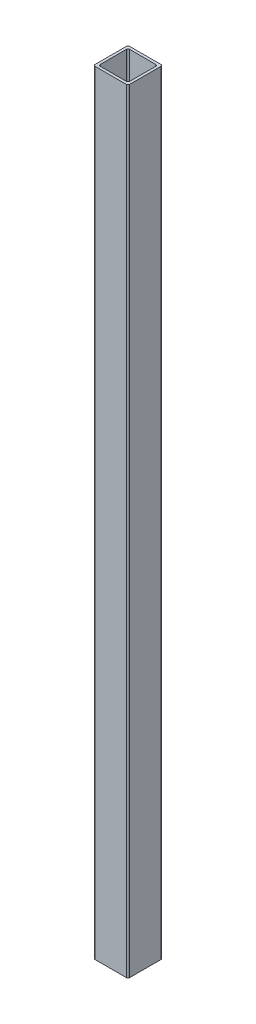
ISO-10303-21;
HEADER;
FILE_DESCRIPTION(('STEP AP214'),'2;1');
FILE_NAME('part.step','',(''),(''),'','','');
FILE_SCHEMA(('AUTOMOTIVE_DESIGN { 1 0 10303 214 1 1 1 1 }'));
ENDSEC;
DATA;
#1=APPLICATION_CONTEXT('core data for automotive mechanical design processes');
#2=APPLICATION_PROTOCOL_DEFINITION('international standard','automotive_design',2000,#1);
#3=PRODUCT_CONTEXT('',#1,'mechanical');
#4=PRODUCT('Part','Part','',(#3));
#5=PRODUCT_RELATED_PRODUCT_CATEGORY('part','',(#4));
#6=PRODUCT_DEFINITION_FORMATION('','',#4);
#7=PRODUCT_DEFINITION_CONTEXT('part definition',#1,'design');
#8=PRODUCT_DEFINITION('design','',#6,#7);
#9=PRODUCT_DEFINITION_SHAPE('','',#8);
#10=(LENGTH_UNIT() NAMED_UNIT(*) SI_UNIT(.MILLI.,.METRE.));
#11=(NAMED_UNIT(*) PLANE_ANGLE_UNIT() SI_UNIT($,.RADIAN.));
#12=(NAMED_UNIT(*) SI_UNIT($,.STERADIAN.) SOLID_ANGLE_UNIT());
#13=UNCERTAINTY_MEASURE_WITH_UNIT(LENGTH_MEASURE(1.E-05),#10,'distance_accuracy_value','');
#14=(GEOMETRIC_REPRESENTATION_CONTEXT(3) GLOBAL_UNCERTAINTY_ASSIGNED_CONTEXT((#13)) GLOBAL_UNIT_ASSIGNED_CONTEXT((#10,
#11,#12)) REPRESENTATION_CONTEXT('',''));
#15=CARTESIAN_POINT('',(0.,0.,0.));
#16=DIRECTION('',(0.,0.,1.));
#17=DIRECTION('',(1.,0.,0.));
#18=AXIS2_PLACEMENT_3D('',#15,#16,#17);
#19=CARTESIAN_POINT('',(-9.,447.59,9.00000000000001));
#20=DIRECTION('',(0.,-1.,0.));
#21=DIRECTION('',(0.,0.,-1.));
#22=AXIS2_PLACEMENT_3D('',#19,#20,#21);
#23=PLANE('',#22);
#24=CARTESIAN_POINT('',(-9.,447.59,9.00000000000001));
#25=DIRECTION('',(0.,1.,0.));
#26=DIRECTION('',(0.,0.,-1.));
#27=AXIS2_PLACEMENT_3D('',#24,#25,#26);
#28=CIRCLE('',#27,1.);
#29=CARTESIAN_POINT('',(-10.,447.59,9.00000000000001));
#30=VERTEX_POINT('',#29);
#31=CARTESIAN_POINT('',(-9.,447.59,10.));
#32=VERTEX_POINT('',#31);
#33=EDGE_CURVE('E215',#30,#32,#28,.T.);
#34=ORIENTED_EDGE('',*,*,#33,.T.);
#35=DIRECTION('',(1.,0.,0.));
#36=VECTOR('',#35,1.);
#37=CARTESIAN_POINT('',(-9.,447.59,10.));
#38=LINE('',#37,#36);
#39=CARTESIAN_POINT('',(9.,447.59,10.));
#40=VERTEX_POINT('',#39);
#41=EDGE_CURVE('E218',#32,#40,#38,.T.);
#42=ORIENTED_EDGE('',*,*,#41,.T.);
#43=CARTESIAN_POINT('',(9.,447.59,9.00000000000001));
#44=DIRECTION('',(0.,1.,0.));
#45=DIRECTION('',(0.,0.,1.));
#46=AXIS2_PLACEMENT_3D('',#43,#44,#45);
#47=CIRCLE('',#46,1.);
#48=CARTESIAN_POINT('',(10.,447.59,9.00000000000001));
#49=VERTEX_POINT('',#48);
#50=EDGE_CURVE('E221',#40,#49,#47,.T.);
#51=ORIENTED_EDGE('',*,*,#50,.T.);
#52=DIRECTION('',(0.,0.,-1.));
#53=VECTOR('',#52,1.);
#54=CARTESIAN_POINT('',(10.,447.59,9.00000000000001));
#55=LINE('',#54,#53);
#56=CARTESIAN_POINT('',(10.,447.59,-9.));
#57=VERTEX_POINT('',#56);
#58=EDGE_CURVE('E223',#49,#57,#55,.T.);
#59=ORIENTED_EDGE('',*,*,#58,.T.);
#60=CARTESIAN_POINT('',(9.,447.59,-9.));
#61=DIRECTION('',(0.,1.,0.));
#62=DIRECTION('',(0.,0.,-1.));
#63=AXIS2_PLACEMENT_3D('',#60,#61,#62);
#64=CIRCLE('',#63,1.);
#65=CARTESIAN_POINT('',(9.,447.59,-10.));
#66=VERTEX_POINT('',#65);
#67=EDGE_CURVE('E225',#57,#66,#64,.T.);
#68=ORIENTED_EDGE('',*,*,#67,.T.);
#69=DIRECTION('',(-1.,0.,0.));
#70=VECTOR('',#69,1.);
#71=CARTESIAN_POINT('',(-9.,447.59,-10.));
#72=LINE('',#71,#70);
#73=CARTESIAN_POINT('',(-9.,447.59,-10.));
#74=VERTEX_POINT('',#73);
#75=EDGE_CURVE('E227',#66,#74,#72,.T.);
#76=ORIENTED_EDGE('',*,*,#75,.T.);
#77=CARTESIAN_POINT('',(-9.,447.59,-9.));
#78=DIRECTION('',(0.,1.,0.));
#79=DIRECTION('',(0.,0.,-1.));
#80=AXIS2_PLACEMENT_3D('',#77,#78,#79);
#81=CIRCLE('',#80,1.);
#82=CARTESIAN_POINT('',(-10.,447.59,-9.));
#83=VERTEX_POINT('',#82);
#84=EDGE_CURVE('E229',#74,#83,#81,.T.);
#85=ORIENTED_EDGE('',*,*,#84,.T.);
#86=DIRECTION('',(0.,0.,1.));
#87=VECTOR('',#86,1.);
#88=CARTESIAN_POINT('',(-10.,447.59,9.00000000000001));
#89=LINE('',#88,#87);
#90=EDGE_CURVE('E231',#83,#30,#89,.T.);
#91=ORIENTED_EDGE('',*,*,#90,.T.);
#92=EDGE_LOOP('',(#34,#42,#51,#59,#68,#76,#85,#91));
#93=FACE_BOUND('',#92,.T.);
#94=CARTESIAN_POINT('',(-7.5,447.59,7.5));
#95=DIRECTION('',(0.,1.,0.));
#96=DIRECTION('',(0.,0.,-1.));
#97=AXIS2_PLACEMENT_3D('',#94,#95,#96);
#98=CIRCLE('',#97,1.);
#99=CARTESIAN_POINT('',(-8.5,447.59,7.5));
#100=VERTEX_POINT('',#99);
#101=CARTESIAN_POINT('',(-7.5,447.59,8.5));
#102=VERTEX_POINT('',#101);
#103=EDGE_CURVE('E150',#100,#102,#98,.T.);
#104=ORIENTED_EDGE('',*,*,#103,.F.);
#105=DIRECTION('',(0.,0.,1.));
#106=VECTOR('',#105,1.);
#107=CARTESIAN_POINT('',(-8.5,447.59,7.5));
#108=LINE('',#107,#106);
#109=CARTESIAN_POINT('',(-8.5,447.59,-7.5));
#110=VERTEX_POINT('',#109);
#111=EDGE_CURVE('E183',#110,#100,#108,.T.);
#112=ORIENTED_EDGE('',*,*,#111,.F.);
#113=CARTESIAN_POINT('',(-7.5,447.59,-7.5));
#114=DIRECTION('',(0.,1.,0.));
#115=DIRECTION('',(0.,0.,-1.));
#116=AXIS2_PLACEMENT_3D('',#113,#114,#115);
#117=CIRCLE('',#116,0.999999999999999);
#118=CARTESIAN_POINT('',(-7.5,447.59,-8.5));
#119=VERTEX_POINT('',#118);
#120=EDGE_CURVE('E181',#119,#110,#117,.T.);
#121=ORIENTED_EDGE('',*,*,#120,.F.);
#122=DIRECTION('',(-1.,0.,0.));
#123=VECTOR('',#122,1.);
#124=CARTESIAN_POINT('',(-7.5,447.59,-8.5));
#125=LINE('',#124,#123);
#126=CARTESIAN_POINT('',(7.5,447.59,-8.5));
#127=VERTEX_POINT('',#126);
#128=EDGE_CURVE('E179',#127,#119,#125,.T.);
#129=ORIENTED_EDGE('',*,*,#128,.F.);
#130=CARTESIAN_POINT('',(7.5,447.59,-7.5));
#131=DIRECTION('',(0.,1.,0.));
#132=DIRECTION('',(0.,0.,-1.));
#133=AXIS2_PLACEMENT_3D('',#130,#131,#132);
#134=CIRCLE('',#133,1.);
#135=CARTESIAN_POINT('',(8.5,447.59,-7.5));
#136=VERTEX_POINT('',#135);
#137=EDGE_CURVE('E177',#136,#127,#134,.T.);
#138=ORIENTED_EDGE('',*,*,#137,.F.);
#139=DIRECTION('',(0.,0.,-1.));
#140=VECTOR('',#139,1.);
#141=CARTESIAN_POINT('',(8.5,447.59,7.5));
#142=LINE('',#141,#140);
#143=CARTESIAN_POINT('',(8.5,447.59,7.5));
#144=VERTEX_POINT('',#143);
#145=EDGE_CURVE('E173',#144,#136,#142,.T.);
#146=ORIENTED_EDGE('',*,*,#145,.F.);
#147=CARTESIAN_POINT('',(7.5,447.59,7.5));
#148=DIRECTION('',(0.,1.,0.));
#149=DIRECTION('',(0.,0.,1.));
#150=AXIS2_PLACEMENT_3D('',#147,#148,#149);
#151=CIRCLE('',#150,1.);
#152=CARTESIAN_POINT('',(7.5,447.59,8.5));
#153=VERTEX_POINT('',#152);
#154=EDGE_CURVE('E171',#153,#144,#151,.T.);
#155=ORIENTED_EDGE('',*,*,#154,.F.);
#156=DIRECTION('',(1.,0.,0.));
#157=VECTOR('',#156,1.);
#158=CARTESIAN_POINT('',(-7.5,447.59,8.5));
#159=LINE('',#158,#157);
#160=EDGE_CURVE('E158',#102,#153,#159,.T.);
#161=ORIENTED_EDGE('',*,*,#160,.F.);
#162=EDGE_LOOP('',(#104,#112,#121,#129,#138,#146,#155,#161));
#163=FACE_BOUND('',#162,.T.);
#164=ADVANCED_FACE('F37',(#93,#163),#23,.F.);
#165=CARTESIAN_POINT('',(-9.,0.,9.00000000000001));
#166=DIRECTION('',(0.,-1.,0.));
#167=DIRECTION('',(0.,0.,-1.));
#168=AXIS2_PLACEMENT_3D('',#165,#166,#167);
#169=PLANE('',#168);
#170=CARTESIAN_POINT('',(-9.,0.,9.00000000000001));
#171=DIRECTION('',(0.,1.,0.));
#172=DIRECTION('',(0.,0.,-1.));
#173=AXIS2_PLACEMENT_3D('',#170,#171,#172);
#174=CIRCLE('',#173,1.);
#175=CARTESIAN_POINT('',(-10.,0.,9.00000000000001));
#176=VERTEX_POINT('',#175);
#177=CARTESIAN_POINT('',(-9.,0.,10.));
#178=VERTEX_POINT('',#177);
#179=EDGE_CURVE('E166',#176,#178,#174,.T.);
#180=ORIENTED_EDGE('',*,*,#179,.F.);
#181=DIRECTION('',(0.,0.,1.));
#182=VECTOR('',#181,1.);
#183=CARTESIAN_POINT('',(-10.,0.,9.00000000000001));
#184=LINE('',#183,#182);
#185=CARTESIAN_POINT('',(-10.,0.,-9.));
#186=VERTEX_POINT('',#185);
#187=EDGE_CURVE('E219',#186,#176,#184,.T.);
#188=ORIENTED_EDGE('',*,*,#187,.F.);
#189=CARTESIAN_POINT('',(-9.,0.,-9.));
#190=DIRECTION('',(0.,1.,0.));
#191=DIRECTION('',(0.,0.,-1.));
#192=AXIS2_PLACEMENT_3D('',#189,#190,#191);
#193=CIRCLE('',#192,1.);
#194=CARTESIAN_POINT('',(-9.,0.,-10.));
#195=VERTEX_POINT('',#194);
#196=EDGE_CURVE('E246',#195,#186,#193,.T.);
#197=ORIENTED_EDGE('',*,*,#196,.F.);
#198=DIRECTION('',(-1.,0.,0.));
#199=VECTOR('',#198,1.);
#200=CARTESIAN_POINT('',(-9.,0.,-10.));
#201=LINE('',#200,#199);
#202=CARTESIAN_POINT('',(9.,0.,-10.));
#203=VERTEX_POINT('',#202);
#204=EDGE_CURVE('E244',#203,#195,#201,.T.);
#205=ORIENTED_EDGE('',*,*,#204,.F.);
#206=CARTESIAN_POINT('',(9.,0.,-9.));
#207=DIRECTION('',(0.,1.,0.));
#208=DIRECTION('',(0.,0.,-1.));
#209=AXIS2_PLACEMENT_3D('',#206,#207,#208);
#210=CIRCLE('',#209,1.);
#211=CARTESIAN_POINT('',(10.,0.,-9.));
#212=VERTEX_POINT('',#211);
#213=EDGE_CURVE('E242',#212,#203,#210,.T.);
#214=ORIENTED_EDGE('',*,*,#213,.F.);
#215=DIRECTION('',(0.,0.,-1.));
#216=VECTOR('',#215,1.);
#217=CARTESIAN_POINT('',(10.,0.,9.00000000000001));
#218=LINE('',#217,#216);
#219=CARTESIAN_POINT('',(10.,0.,9.00000000000001));
#220=VERTEX_POINT('',#219);
#221=EDGE_CURVE('E240',#220,#212,#218,.T.);
#222=ORIENTED_EDGE('',*,*,#221,.F.);
#223=CARTESIAN_POINT('',(9.,0.,9.00000000000001));
#224=DIRECTION('',(0.,1.,0.));
#225=DIRECTION('',(0.,0.,1.));
#226=AXIS2_PLACEMENT_3D('',#223,#224,#225);
#227=CIRCLE('',#226,1.);
#228=CARTESIAN_POINT('',(9.,0.,10.));
#229=VERTEX_POINT('',#228);
#230=EDGE_CURVE('E238',#229,#220,#227,.T.);
#231=ORIENTED_EDGE('',*,*,#230,.F.);
#232=DIRECTION('',(1.,0.,0.));
#233=VECTOR('',#232,1.);
#234=CARTESIAN_POINT('',(-9.,0.,10.));
#235=LINE('',#234,#233);
#236=EDGE_CURVE('E236',#178,#229,#235,.T.);
#237=ORIENTED_EDGE('',*,*,#236,.F.);
#238=EDGE_LOOP('',(#180,#188,#197,#205,#214,#222,#231,#237));
#239=FACE_BOUND('',#238,.T.);
#240=DIRECTION('',(0.,0.,1.));
#241=VECTOR('',#240,1.);
#242=CARTESIAN_POINT('',(-8.5,0.,7.5));
#243=LINE('',#242,#241);
#244=CARTESIAN_POINT('',(-8.5,0.,-7.5));
#245=VERTEX_POINT('',#244);
#246=CARTESIAN_POINT('',(-8.5,0.,7.5));
#247=VERTEX_POINT('',#246);
#248=EDGE_CURVE('E159',#245,#247,#243,.T.);
#249=ORIENTED_EDGE('',*,*,#248,.T.);
#250=CARTESIAN_POINT('',(-7.5,0.,7.5));
#251=DIRECTION('',(0.,1.,0.));
#252=DIRECTION('',(0.,0.,-1.));
#253=AXIS2_PLACEMENT_3D('',#250,#251,#252);
#254=CIRCLE('',#253,1.);
#255=CARTESIAN_POINT('',(-7.5,0.,8.5));
#256=VERTEX_POINT('',#255);
#257=EDGE_CURVE('E60',#247,#256,#254,.T.);
#258=ORIENTED_EDGE('',*,*,#257,.T.);
#259=DIRECTION('',(1.,0.,0.));
#260=VECTOR('',#259,1.);
#261=CARTESIAN_POINT('',(-7.5,0.,8.5));
#262=LINE('',#261,#260);
#263=CARTESIAN_POINT('',(7.5,0.,8.5));
#264=VERTEX_POINT('',#263);
#265=EDGE_CURVE('E165',#256,#264,#262,.T.);
#266=ORIENTED_EDGE('',*,*,#265,.T.);
#267=CARTESIAN_POINT('',(7.5,0.,7.5));
#268=DIRECTION('',(0.,1.,0.));
#269=DIRECTION('',(0.,0.,1.));
#270=AXIS2_PLACEMENT_3D('',#267,#268,#269);
#271=CIRCLE('',#270,1.);
#272=CARTESIAN_POINT('',(8.5,0.,7.5));
#273=VERTEX_POINT('',#272);
#274=EDGE_CURVE('E187',#264,#273,#271,.T.);
#275=ORIENTED_EDGE('',*,*,#274,.T.);
#276=DIRECTION('',(0.,0.,-1.));
#277=VECTOR('',#276,1.);
#278=CARTESIAN_POINT('',(8.5,0.,7.5));
#279=LINE('',#278,#277);
#280=CARTESIAN_POINT('',(8.5,0.,-7.5));
#281=VERTEX_POINT('',#280);
#282=EDGE_CURVE('E190',#273,#281,#279,.T.);
#283=ORIENTED_EDGE('',*,*,#282,.T.);
#284=CARTESIAN_POINT('',(7.5,0.,-7.5));
#285=DIRECTION('',(0.,1.,0.));
#286=DIRECTION('',(0.,0.,-1.));
#287=AXIS2_PLACEMENT_3D('',#284,#285,#286);
#288=CIRCLE('',#287,1.);
#289=CARTESIAN_POINT('',(7.5,0.,-8.5));
#290=VERTEX_POINT('',#289);
#291=EDGE_CURVE('E193',#281,#290,#288,.T.);
#292=ORIENTED_EDGE('',*,*,#291,.T.);
#293=DIRECTION('',(-1.,0.,0.));
#294=VECTOR('',#293,1.);
#295=CARTESIAN_POINT('',(-7.5,0.,-8.5));
#296=LINE('',#295,#294);
#297=CARTESIAN_POINT('',(-7.5,0.,-8.5));
#298=VERTEX_POINT('',#297);
#299=EDGE_CURVE('E196',#290,#298,#296,.T.);
#300=ORIENTED_EDGE('',*,*,#299,.T.);
#301=CARTESIAN_POINT('',(-7.5,0.,-7.5));
#302=DIRECTION('',(0.,1.,0.));
#303=DIRECTION('',(0.,0.,-1.));
#304=AXIS2_PLACEMENT_3D('',#301,#302,#303);
#305=CIRCLE('',#304,0.999999999999999);
#306=EDGE_CURVE('E199',#298,#245,#305,.T.);
#307=ORIENTED_EDGE('',*,*,#306,.T.);
#308=EDGE_LOOP('',(#249,#258,#266,#275,#283,#292,#300,#307));
#309=FACE_BOUND('',#308,.T.);
#310=ADVANCED_FACE('F276',(#239,#309),#169,.T.);
#311=CARTESIAN_POINT('',(-9.,447.59,9.00000000000001));
#312=DIRECTION('',(0.,-1.,0.));
#313=DIRECTION('',(0.,0.,-1.));
#314=AXIS2_PLACEMENT_3D('',#311,#312,#313);
#315=CYLINDRICAL_SURFACE('',#314,1.);
#316=ORIENTED_EDGE('',*,*,#179,.T.);
#317=DIRECTION('',(0.,-1.,0.));
#318=VECTOR('',#317,1.);
#319=CARTESIAN_POINT('',(-9.,447.59,10.));
#320=LINE('',#319,#318);
#321=EDGE_CURVE('E11',#32,#178,#320,.T.);
#322=ORIENTED_EDGE('',*,*,#321,.F.);
#323=ORIENTED_EDGE('',*,*,#33,.F.);
#324=DIRECTION('',(0.,-1.,0.));
#325=VECTOR('',#324,1.);
#326=CARTESIAN_POINT('',(-10.,447.59,9.00000000000001));
#327=LINE('',#326,#325);
#328=EDGE_CURVE('E233',#30,#176,#327,.T.);
#329=ORIENTED_EDGE('',*,*,#328,.T.);
#330=EDGE_LOOP('',(#316,#322,#323,#329));
#331=FACE_BOUND('',#330,.T.);
#332=ADVANCED_FACE('F39',(#331),#315,.T.);
#333=CARTESIAN_POINT('',(-9.,447.59,10.));
#334=DIRECTION('',(0.,0.,-1.));
#335=DIRECTION('',(-1.,0.,0.));
#336=AXIS2_PLACEMENT_3D('',#333,#334,#335);
#337=PLANE('',#336);
#338=ORIENTED_EDGE('',*,*,#236,.T.);
#339=DIRECTION('',(0.,-1.,0.));
#340=VECTOR('',#339,1.);
#341=CARTESIAN_POINT('',(9.,447.59,10.));
#342=LINE('',#341,#340);
#343=EDGE_CURVE('E45',#40,#229,#342,.T.);
#344=ORIENTED_EDGE('',*,*,#343,.F.);
#345=ORIENTED_EDGE('',*,*,#41,.F.);
#346=ORIENTED_EDGE('',*,*,#321,.T.);
#347=EDGE_LOOP('',(#338,#344,#345,#346));
#348=FACE_BOUND('',#347,.T.);
#349=ADVANCED_FACE('F293',(#348),#337,.F.);
#350=CARTESIAN_POINT('',(9.,447.59,9.00000000000001));
#351=DIRECTION('',(0.,-1.,0.));
#352=DIRECTION('',(0.,0.,-1.));
#353=AXIS2_PLACEMENT_3D('',#350,#351,#352);
#354=CYLINDRICAL_SURFACE('',#353,1.);
#355=ORIENTED_EDGE('',*,*,#230,.T.);
#356=DIRECTION('',(0.,-1.,0.));
#357=VECTOR('',#356,1.);
#358=CARTESIAN_POINT('',(10.,447.59,9.00000000000001));
#359=LINE('',#358,#357);
#360=EDGE_CURVE('E263',#49,#220,#359,.T.);
#361=ORIENTED_EDGE('',*,*,#360,.F.);
#362=ORIENTED_EDGE('',*,*,#50,.F.);
#363=ORIENTED_EDGE('',*,*,#343,.T.);
#364=EDGE_LOOP('',(#355,#361,#362,#363));
#365=FACE_BOUND('',#364,.T.);
#366=ADVANCED_FACE('F270',(#365),#354,.T.);
#367=CARTESIAN_POINT('',(10.,447.59,9.00000000000001));
#368=DIRECTION('',(-1.,0.,0.));
#369=DIRECTION('',(0.,0.,1.));
#370=AXIS2_PLACEMENT_3D('',#367,#368,#369);
#371=PLANE('',#370);
#372=ORIENTED_EDGE('',*,*,#221,.T.);
#373=DIRECTION('',(0.,-1.,0.));
#374=VECTOR('',#373,1.);
#375=CARTESIAN_POINT('',(10.,447.59,-9.));
#376=LINE('',#375,#374);
#377=EDGE_CURVE('E260',#57,#212,#376,.T.);
#378=ORIENTED_EDGE('',*,*,#377,.F.);
#379=ORIENTED_EDGE('',*,*,#58,.F.);
#380=ORIENTED_EDGE('',*,*,#360,.T.);
#381=EDGE_LOOP('',(#372,#378,#379,#380));
#382=FACE_BOUND('',#381,.T.);
#383=ADVANCED_FACE('F282',(#382),#371,.F.);
#384=CARTESIAN_POINT('',(9.,447.59,-9.));
#385=DIRECTION('',(0.,-1.,0.));
#386=DIRECTION('',(0.,0.,-1.));
#387=AXIS2_PLACEMENT_3D('',#384,#385,#386);
#388=CYLINDRICAL_SURFACE('',#387,1.);
#389=ORIENTED_EDGE('',*,*,#213,.T.);
#390=DIRECTION('',(0.,-1.,0.));
#391=VECTOR('',#390,1.);
#392=CARTESIAN_POINT('',(9.,447.59,-10.));
#393=LINE('',#392,#391);
#394=EDGE_CURVE('E257',#66,#203,#393,.T.);
#395=ORIENTED_EDGE('',*,*,#394,.F.);
#396=ORIENTED_EDGE('',*,*,#67,.F.);
#397=ORIENTED_EDGE('',*,*,#377,.T.);
#398=EDGE_LOOP('',(#389,#395,#396,#397));
#399=FACE_BOUND('',#398,.T.);
#400=ADVANCED_FACE('F286',(#399),#388,.T.);
#401=CARTESIAN_POINT('',(-9.,447.59,-10.));
#402=DIRECTION('',(0.,0.,1.));
#403=DIRECTION('',(1.,0.,0.));
#404=AXIS2_PLACEMENT_3D('',#401,#402,#403);
#405=PLANE('',#404);
#406=ORIENTED_EDGE('',*,*,#204,.T.);
#407=DIRECTION('',(0.,-1.,0.));
#408=VECTOR('',#407,1.);
#409=CARTESIAN_POINT('',(-9.,447.59,-10.));
#410=LINE('',#409,#408);
#411=EDGE_CURVE('E254',#74,#195,#410,.T.);
#412=ORIENTED_EDGE('',*,*,#411,.F.);
#413=ORIENTED_EDGE('',*,*,#75,.F.);
#414=ORIENTED_EDGE('',*,*,#394,.T.);
#415=EDGE_LOOP('',(#406,#412,#413,#414));
#416=FACE_BOUND('',#415,.T.);
#417=ADVANCED_FACE('F306',(#416),#405,.F.);
#418=CARTESIAN_POINT('',(-9.,447.59,-9.));
#419=DIRECTION('',(0.,-1.,0.));
#420=DIRECTION('',(0.,0.,-1.));
#421=AXIS2_PLACEMENT_3D('',#418,#419,#420);
#422=CYLINDRICAL_SURFACE('',#421,1.);
#423=ORIENTED_EDGE('',*,*,#196,.T.);
#424=DIRECTION('',(0.,-1.,0.));
#425=VECTOR('',#424,1.);
#426=CARTESIAN_POINT('',(-10.,447.59,-9.));
#427=LINE('',#426,#425);
#428=EDGE_CURVE('E251',#83,#186,#427,.T.);
#429=ORIENTED_EDGE('',*,*,#428,.F.);
#430=ORIENTED_EDGE('',*,*,#84,.F.);
#431=ORIENTED_EDGE('',*,*,#411,.T.);
#432=EDGE_LOOP('',(#423,#429,#430,#431));
#433=FACE_BOUND('',#432,.T.);
#434=ADVANCED_FACE('F304',(#433),#422,.T.);
#435=CARTESIAN_POINT('',(-10.,447.59,9.00000000000001));
#436=DIRECTION('',(1.,0.,0.));
#437=DIRECTION('',(0.,0.,-1.));
#438=AXIS2_PLACEMENT_3D('',#435,#436,#437);
#439=PLANE('',#438);
#440=ORIENTED_EDGE('',*,*,#187,.T.);
#441=ORIENTED_EDGE('',*,*,#328,.F.);
#442=ORIENTED_EDGE('',*,*,#90,.F.);
#443=ORIENTED_EDGE('',*,*,#428,.T.);
#444=EDGE_LOOP('',(#440,#441,#442,#443));
#445=FACE_BOUND('',#444,.T.);
#446=ADVANCED_FACE('F299',(#445),#439,.F.);
#447=CARTESIAN_POINT('',(-7.5,447.59,7.5));
#448=DIRECTION('',(0.,-1.,0.));
#449=DIRECTION('',(0.,0.,-1.));
#450=AXIS2_PLACEMENT_3D('',#447,#448,#449);
#451=CYLINDRICAL_SURFACE('',#450,1.);
#452=ORIENTED_EDGE('',*,*,#257,.F.);
#453=DIRECTION('',(0.,-1.,0.));
#454=VECTOR('',#453,1.);
#455=CARTESIAN_POINT('',(-8.5,447.59,7.5));
#456=LINE('',#455,#454);
#457=EDGE_CURVE('E154',#100,#247,#456,.T.);
#458=ORIENTED_EDGE('',*,*,#457,.F.);
#459=ORIENTED_EDGE('',*,*,#103,.T.);
#460=DIRECTION('',(0.,-1.,0.));
#461=VECTOR('',#460,1.);
#462=CARTESIAN_POINT('',(-7.5,447.59,8.5));
#463=LINE('',#462,#461);
#464=EDGE_CURVE('E153',#102,#256,#463,.T.);
#465=ORIENTED_EDGE('',*,*,#464,.T.);
#466=EDGE_LOOP('',(#452,#458,#459,#465));
#467=FACE_BOUND('',#466,.T.);
#468=ADVANCED_FACE('F152',(#467),#451,.F.);
#469=CARTESIAN_POINT('',(-7.5,447.59,8.5));
#470=DIRECTION('',(0.,0.,-1.));
#471=DIRECTION('',(-1.,0.,0.));
#472=AXIS2_PLACEMENT_3D('',#469,#470,#471);
#473=PLANE('',#472);
#474=ORIENTED_EDGE('',*,*,#265,.F.);
#475=ORIENTED_EDGE('',*,*,#464,.F.);
#476=ORIENTED_EDGE('',*,*,#160,.T.);
#477=DIRECTION('',(0.,-1.,0.));
#478=VECTOR('',#477,1.);
#479=CARTESIAN_POINT('',(7.5,447.59,8.5));
#480=LINE('',#479,#478);
#481=EDGE_CURVE('E167',#153,#264,#480,.T.);
#482=ORIENTED_EDGE('',*,*,#481,.T.);
#483=EDGE_LOOP('',(#474,#475,#476,#482));
#484=FACE_BOUND('',#483,.T.);
#485=ADVANCED_FACE('F162',(#484),#473,.T.);
#486=CARTESIAN_POINT('',(7.5,447.59,7.5));
#487=DIRECTION('',(0.,-1.,0.));
#488=DIRECTION('',(0.,0.,-1.));
#489=AXIS2_PLACEMENT_3D('',#486,#487,#488);
#490=CYLINDRICAL_SURFACE('',#489,1.);
#491=ORIENTED_EDGE('',*,*,#274,.F.);
#492=ORIENTED_EDGE('',*,*,#481,.F.);
#493=ORIENTED_EDGE('',*,*,#154,.T.);
#494=DIRECTION('',(0.,-1.,0.));
#495=VECTOR('',#494,1.);
#496=CARTESIAN_POINT('',(8.5,447.59,7.5));
#497=LINE('',#496,#495);
#498=EDGE_CURVE('E212',#144,#273,#497,.T.);
#499=ORIENTED_EDGE('',*,*,#498,.T.);
#500=EDGE_LOOP('',(#491,#492,#493,#499));
#501=FACE_BOUND('',#500,.T.);
#502=ADVANCED_FACE('F331',(#501),#490,.F.);
#503=CARTESIAN_POINT('',(8.5,447.59,7.5));
#504=DIRECTION('',(-1.,0.,0.));
#505=DIRECTION('',(0.,0.,1.));
#506=AXIS2_PLACEMENT_3D('',#503,#504,#505);
#507=PLANE('',#506);
#508=ORIENTED_EDGE('',*,*,#282,.F.);
#509=ORIENTED_EDGE('',*,*,#498,.F.);
#510=ORIENTED_EDGE('',*,*,#145,.T.);
#511=DIRECTION('',(0.,-1.,0.));
#512=VECTOR('',#511,1.);
#513=CARTESIAN_POINT('',(8.5,447.59,-7.5));
#514=LINE('',#513,#512);
#515=EDGE_CURVE('E210',#136,#281,#514,.T.);
#516=ORIENTED_EDGE('',*,*,#515,.T.);
#517=EDGE_LOOP('',(#508,#509,#510,#516));
#518=FACE_BOUND('',#517,.T.);
#519=ADVANCED_FACE('F335',(#518),#507,.T.);
#520=CARTESIAN_POINT('',(7.5,447.59,-7.5));
#521=DIRECTION('',(0.,-1.,0.));
#522=DIRECTION('',(0.,0.,-1.));
#523=AXIS2_PLACEMENT_3D('',#520,#521,#522);
#524=CYLINDRICAL_SURFACE('',#523,1.);
#525=ORIENTED_EDGE('',*,*,#291,.F.);
#526=ORIENTED_EDGE('',*,*,#515,.F.);
#527=ORIENTED_EDGE('',*,*,#137,.T.);
#528=DIRECTION('',(0.,-1.,0.));
#529=VECTOR('',#528,1.);
#530=CARTESIAN_POINT('',(7.5,447.59,-8.5));
#531=LINE('',#530,#529);
#532=EDGE_CURVE('E208',#127,#290,#531,.T.);
#533=ORIENTED_EDGE('',*,*,#532,.T.);
#534=EDGE_LOOP('',(#525,#526,#527,#533));
#535=FACE_BOUND('',#534,.T.);
#536=ADVANCED_FACE('F341',(#535),#524,.F.);
#537=CARTESIAN_POINT('',(-7.5,447.59,-8.5));
#538=DIRECTION('',(0.,0.,1.));
#539=DIRECTION('',(1.,0.,0.));
#540=AXIS2_PLACEMENT_3D('',#537,#538,#539);
#541=PLANE('',#540);
#542=ORIENTED_EDGE('',*,*,#299,.F.);
#543=ORIENTED_EDGE('',*,*,#532,.F.);
#544=ORIENTED_EDGE('',*,*,#128,.T.);
#545=DIRECTION('',(0.,-1.,0.));
#546=VECTOR('',#545,1.);
#547=CARTESIAN_POINT('',(-7.5,447.59,-8.5));
#548=LINE('',#547,#546);
#549=EDGE_CURVE('E206',#119,#298,#548,.T.);
#550=ORIENTED_EDGE('',*,*,#549,.T.);
#551=EDGE_LOOP('',(#542,#543,#544,#550));
#552=FACE_BOUND('',#551,.T.);
#553=ADVANCED_FACE('F345',(#552),#541,.T.);
#554=CARTESIAN_POINT('',(-7.5,447.59,-7.5));
#555=DIRECTION('',(0.,-1.,0.));
#556=DIRECTION('',(0.,0.,-1.));
#557=AXIS2_PLACEMENT_3D('',#554,#555,#556);
#558=CYLINDRICAL_SURFACE('',#557,0.999999999999999);
#559=ORIENTED_EDGE('',*,*,#306,.F.);
#560=ORIENTED_EDGE('',*,*,#549,.F.);
#561=ORIENTED_EDGE('',*,*,#120,.T.);
#562=DIRECTION('',(0.,-1.,0.));
#563=VECTOR('',#562,1.);
#564=CARTESIAN_POINT('',(-8.5,447.59,-7.5));
#565=LINE('',#564,#563);
#566=EDGE_CURVE('E52',#110,#245,#565,.T.);
#567=ORIENTED_EDGE('',*,*,#566,.T.);
#568=EDGE_LOOP('',(#559,#560,#561,#567));
#569=FACE_BOUND('',#568,.T.);
#570=ADVANCED_FACE('F349',(#569),#558,.F.);
#571=CARTESIAN_POINT('',(-8.5,447.59,7.5));
#572=DIRECTION('',(1.,0.,0.));
#573=DIRECTION('',(0.,0.,-1.));
#574=AXIS2_PLACEMENT_3D('',#571,#572,#573);
#575=PLANE('',#574);
#576=ORIENTED_EDGE('',*,*,#248,.F.);
#577=ORIENTED_EDGE('',*,*,#566,.F.);
#578=ORIENTED_EDGE('',*,*,#111,.T.);
#579=ORIENTED_EDGE('',*,*,#457,.T.);
#580=EDGE_LOOP('',(#576,#577,#578,#579));
#581=FACE_BOUND('',#580,.T.);
#582=ADVANCED_FACE('F353',(#581),#575,.T.);
#583=CLOSED_SHELL('',(#164,#310,#332,#349,#366,#383,#400,#417,#434,#446,#468,#485,#502,#519,
#536,#553,#570,#582));
#584=MANIFOLD_SOLID_BREP('B2',#583);
#585=ADVANCED_BREP_SHAPE_REPRESENTATION('',(#18,#584),#14);
#586=SHAPE_DEFINITION_REPRESENTATION(#9,#585);
ENDSEC;
END-ISO-10303-21;
